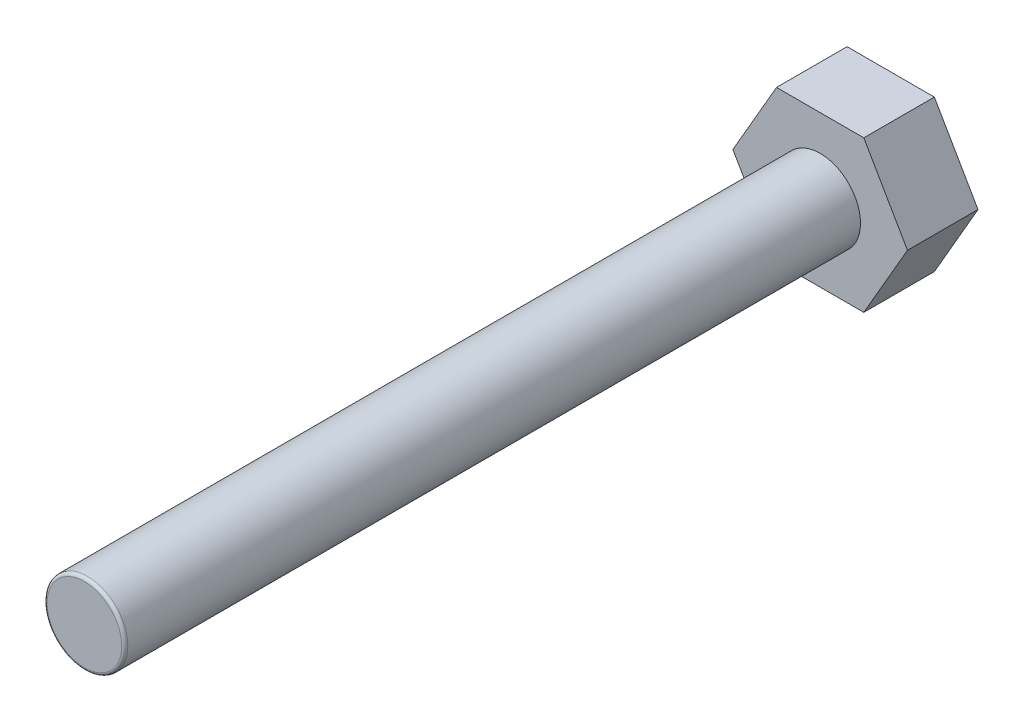
ISO-10303-21;
HEADER;
FILE_DESCRIPTION(('STEP AP214'),'2;1');
FILE_NAME('part.step','',(''),(''),'','','');
FILE_SCHEMA(('AUTOMOTIVE_DESIGN { 1 0 10303 214 1 1 1 1 }'));
ENDSEC;
DATA;
#1=APPLICATION_CONTEXT('core data for automotive mechanical design processes');
#2=APPLICATION_PROTOCOL_DEFINITION('international standard','automotive_design',2000,#1);
#3=PRODUCT_CONTEXT('',#1,'mechanical');
#4=PRODUCT('Part','Part','',(#3));
#5=PRODUCT_RELATED_PRODUCT_CATEGORY('part','',(#4));
#6=PRODUCT_DEFINITION_FORMATION('','',#4);
#7=PRODUCT_DEFINITION_CONTEXT('part definition',#1,'design');
#8=PRODUCT_DEFINITION('design','',#6,#7);
#9=PRODUCT_DEFINITION_SHAPE('','',#8);
#10=(LENGTH_UNIT() NAMED_UNIT(*) SI_UNIT(.MILLI.,.METRE.));
#11=(NAMED_UNIT(*) PLANE_ANGLE_UNIT() SI_UNIT($,.RADIAN.));
#12=(NAMED_UNIT(*) SI_UNIT($,.STERADIAN.) SOLID_ANGLE_UNIT());
#13=UNCERTAINTY_MEASURE_WITH_UNIT(LENGTH_MEASURE(1.E-05),#10,'distance_accuracy_value','');
#14=(GEOMETRIC_REPRESENTATION_CONTEXT(3) GLOBAL_UNCERTAINTY_ASSIGNED_CONTEXT((#13)) GLOBAL_UNIT_ASSIGNED_CONTEXT((#10,
#11,#12)) REPRESENTATION_CONTEXT('',''));
#15=CARTESIAN_POINT('',(0.,0.,0.));
#16=DIRECTION('',(0.,0.,1.));
#17=DIRECTION('',(1.,0.,0.));
#18=AXIS2_PLACEMENT_3D('',#15,#16,#17);
#19=CARTESIAN_POINT('',(0.,0.,80.));
#20=DIRECTION('',(0.,0.,-1.));
#21=DIRECTION('',(-1.,0.,0.));
#22=AXIS2_PLACEMENT_3D('',#19,#20,#21);
#23=CYLINDRICAL_SURFACE('',#22,4.);
#24=CARTESIAN_POINT('',(0.,0.,79.7));
#25=DIRECTION('',(0.,0.,1.));
#26=DIRECTION('',(1.,0.,0.));
#27=AXIS2_PLACEMENT_3D('',#24,#25,#26);
#28=CIRCLE('',#27,4.);
#29=CARTESIAN_POINT('',(4.,0.,79.7));
#30=VERTEX_POINT('',#29);
#31=EDGE_CURVE('E11',#30,#30,#28,.F.);
#32=ORIENTED_EDGE('',*,*,#31,.T.);
#33=EDGE_LOOP('',(#32));
#34=FACE_BOUND('',#33,.T.);
#35=CARTESIAN_POINT('',(0.,0.,7.));
#36=DIRECTION('',(0.,0.,1.));
#37=DIRECTION('',(1.,0.,0.));
#38=AXIS2_PLACEMENT_3D('',#35,#36,#37);
#39=CIRCLE('',#38,4.);
#40=CARTESIAN_POINT('',(4.,0.,7.));
#41=VERTEX_POINT('',#40);
#42=EDGE_CURVE('E124',#41,#41,#39,.T.);
#43=ORIENTED_EDGE('',*,*,#42,.T.);
#44=EDGE_LOOP('',(#43));
#45=FACE_BOUND('',#44,.T.);
#46=ADVANCED_FACE('F33',(#34,#45),#23,.T.);
#47=CARTESIAN_POINT('',(0.,0.,80.));
#48=DIRECTION('',(0.,0.,1.));
#49=DIRECTION('',(1.,0.,0.));
#50=AXIS2_PLACEMENT_3D('',#47,#48,#49);
#51=PLANE('',#50);
#52=CARTESIAN_POINT('',(0.,0.,80.));
#53=DIRECTION('',(0.,0.,1.));
#54=DIRECTION('',(1.,0.,0.));
#55=AXIS2_PLACEMENT_3D('',#52,#53,#54);
#56=CIRCLE('',#55,3.7);
#57=CARTESIAN_POINT('',(3.7,0.,80.));
#58=VERTEX_POINT('',#57);
#59=EDGE_CURVE('E42',#58,#58,#56,.T.);
#60=ORIENTED_EDGE('',*,*,#59,.T.);
#61=EDGE_LOOP('',(#60));
#62=FACE_BOUND('',#61,.T.);
#63=ADVANCED_FACE('F142',(#62),#51,.T.);
#64=CARTESIAN_POINT('',(0.,0.,7.));
#65=DIRECTION('',(0.,0.,1.));
#66=DIRECTION('',(1.,0.,0.));
#67=AXIS2_PLACEMENT_3D('',#64,#65,#66);
#68=PLANE('',#67);
#69=DIRECTION('',(0.5,-0.866025403784438,0.));
#70=VECTOR('',#69,1.);
#71=CARTESIAN_POINT('',(-8.66025403784439,0.,7.));
#72=LINE('',#71,#70);
#73=CARTESIAN_POINT('',(-8.66025403784439,0.,7.));
#74=VERTEX_POINT('',#73);
#75=CARTESIAN_POINT('',(-4.33012701892219,-7.5,7.));
#76=VERTEX_POINT('',#75);
#77=EDGE_CURVE('E131',#74,#76,#72,.T.);
#78=ORIENTED_EDGE('',*,*,#77,.T.);
#79=DIRECTION('',(1.,0.,0.));
#80=VECTOR('',#79,1.);
#81=CARTESIAN_POINT('',(-4.33012701892219,-7.5,7.));
#82=LINE('',#81,#80);
#83=CARTESIAN_POINT('',(4.33012701892219,-7.5,7.));
#84=VERTEX_POINT('',#83);
#85=EDGE_CURVE('E88',#76,#84,#82,.T.);
#86=ORIENTED_EDGE('',*,*,#85,.T.);
#87=DIRECTION('',(0.5,0.866025403784439,0.));
#88=VECTOR('',#87,1.);
#89=CARTESIAN_POINT('',(4.33012701892219,-7.5,7.));
#90=LINE('',#89,#88);
#91=CARTESIAN_POINT('',(8.66025403784439,0.,7.));
#92=VERTEX_POINT('',#91);
#93=EDGE_CURVE('E102',#84,#92,#90,.T.);
#94=ORIENTED_EDGE('',*,*,#93,.T.);
#95=DIRECTION('',(-0.5,0.866025403784438,0.));
#96=VECTOR('',#95,1.);
#97=CARTESIAN_POINT('',(8.66025403784439,0.,7.));
#98=LINE('',#97,#96);
#99=CARTESIAN_POINT('',(4.33012701892219,7.5,7.));
#100=VERTEX_POINT('',#99);
#101=EDGE_CURVE('E95',#92,#100,#98,.T.);
#102=ORIENTED_EDGE('',*,*,#101,.T.);
#103=DIRECTION('',(-1.,0.,0.));
#104=VECTOR('',#103,1.);
#105=CARTESIAN_POINT('',(4.33012701892219,7.5,7.));
#106=LINE('',#105,#104);
#107=CARTESIAN_POINT('',(-4.3301270189222,7.5,7.));
#108=VERTEX_POINT('',#107);
#109=EDGE_CURVE('E100',#100,#108,#106,.T.);
#110=ORIENTED_EDGE('',*,*,#109,.T.);
#111=DIRECTION('',(-0.5,-0.866025403784439,0.));
#112=VECTOR('',#111,1.);
#113=CARTESIAN_POINT('',(-4.3301270189222,7.5,7.));
#114=LINE('',#113,#112);
#115=EDGE_CURVE('E50',#108,#74,#114,.T.);
#116=ORIENTED_EDGE('',*,*,#115,.T.);
#117=EDGE_LOOP('',(#78,#86,#94,#102,#110,#116));
#118=FACE_BOUND('',#117,.T.);
#119=ORIENTED_EDGE('',*,*,#42,.F.);
#120=EDGE_LOOP('',(#119));
#121=FACE_BOUND('',#120,.T.);
#122=ADVANCED_FACE('F97',(#118,#121),#68,.T.);
#123=CARTESIAN_POINT('',(-8.66025403784439,0.,7.));
#124=DIRECTION('',(0.866025403784438,0.5,0.));
#125=DIRECTION('',(-0.5,0.866025403784438,0.));
#126=AXIS2_PLACEMENT_3D('',#123,#124,#125);
#127=PLANE('',#126);
#128=DIRECTION('',(0.5,-0.866025403784438,0.));
#129=VECTOR('',#128,1.);
#130=CARTESIAN_POINT('',(-8.66025403784439,0.,0.));
#131=LINE('',#130,#129);
#132=CARTESIAN_POINT('',(-8.66025403784439,0.,0.));
#133=VERTEX_POINT('',#132);
#134=CARTESIAN_POINT('',(-4.33012701892219,-7.5,0.));
#135=VERTEX_POINT('',#134);
#136=EDGE_CURVE('E120',#133,#135,#131,.T.);
#137=ORIENTED_EDGE('',*,*,#136,.T.);
#138=DIRECTION('',(0.,0.,-1.));
#139=VECTOR('',#138,1.);
#140=CARTESIAN_POINT('',(-4.33012701892219,-7.5,7.));
#141=LINE('',#140,#139);
#142=EDGE_CURVE('E138',#76,#135,#141,.T.);
#143=ORIENTED_EDGE('',*,*,#142,.F.);
#144=ORIENTED_EDGE('',*,*,#77,.F.);
#145=DIRECTION('',(0.,0.,-1.));
#146=VECTOR('',#145,1.);
#147=CARTESIAN_POINT('',(-8.66025403784439,0.,7.));
#148=LINE('',#147,#146);
#149=EDGE_CURVE('E116',#74,#133,#148,.T.);
#150=ORIENTED_EDGE('',*,*,#149,.T.);
#151=EDGE_LOOP('',(#137,#143,#144,#150));
#152=FACE_BOUND('',#151,.T.);
#153=ADVANCED_FACE('F162',(#152),#127,.F.);
#154=CARTESIAN_POINT('',(-4.33012701892219,-7.5,7.));
#155=DIRECTION('',(0.,1.,0.));
#156=DIRECTION('',(0.,0.,1.));
#157=AXIS2_PLACEMENT_3D('',#154,#155,#156);
#158=PLANE('',#157);
#159=DIRECTION('',(1.,0.,0.));
#160=VECTOR('',#159,1.);
#161=CARTESIAN_POINT('',(-4.33012701892219,-7.5,0.));
#162=LINE('',#161,#160);
#163=CARTESIAN_POINT('',(4.33012701892219,-7.5,0.));
#164=VERTEX_POINT('',#163);
#165=EDGE_CURVE('E123',#135,#164,#162,.T.);
#166=ORIENTED_EDGE('',*,*,#165,.T.);
#167=DIRECTION('',(0.,0.,-1.));
#168=VECTOR('',#167,1.);
#169=CARTESIAN_POINT('',(4.33012701892219,-7.5,7.));
#170=LINE('',#169,#168);
#171=EDGE_CURVE('E135',#84,#164,#170,.T.);
#172=ORIENTED_EDGE('',*,*,#171,.F.);
#173=ORIENTED_EDGE('',*,*,#85,.F.);
#174=ORIENTED_EDGE('',*,*,#142,.T.);
#175=EDGE_LOOP('',(#166,#172,#173,#174));
#176=FACE_BOUND('',#175,.T.);
#177=ADVANCED_FACE('F165',(#176),#158,.F.);
#178=CARTESIAN_POINT('',(4.33012701892219,-7.5,7.));
#179=DIRECTION('',(-0.866025403784439,0.5,0.));
#180=DIRECTION('',(-0.5,-0.866025403784439,0.));
#181=AXIS2_PLACEMENT_3D('',#178,#179,#180);
#182=PLANE('',#181);
#183=DIRECTION('',(0.5,0.866025403784439,0.));
#184=VECTOR('',#183,1.);
#185=CARTESIAN_POINT('',(4.33012701892219,-7.5,0.));
#186=LINE('',#185,#184);
#187=CARTESIAN_POINT('',(8.66025403784439,0.,0.));
#188=VERTEX_POINT('',#187);
#189=EDGE_CURVE('E126',#164,#188,#186,.T.);
#190=ORIENTED_EDGE('',*,*,#189,.T.);
#191=DIRECTION('',(0.,0.,-1.));
#192=VECTOR('',#191,1.);
#193=CARTESIAN_POINT('',(8.66025403784439,0.,7.));
#194=LINE('',#193,#192);
#195=EDGE_CURVE('E111',#92,#188,#194,.T.);
#196=ORIENTED_EDGE('',*,*,#195,.F.);
#197=ORIENTED_EDGE('',*,*,#93,.F.);
#198=ORIENTED_EDGE('',*,*,#171,.T.);
#199=EDGE_LOOP('',(#190,#196,#197,#198));
#200=FACE_BOUND('',#199,.T.);
#201=ADVANCED_FACE('F169',(#200),#182,.F.);
#202=CARTESIAN_POINT('',(8.66025403784439,0.,7.));
#203=DIRECTION('',(-0.866025403784438,-0.5,0.));
#204=DIRECTION('',(0.5,-0.866025403784439,0.));
#205=AXIS2_PLACEMENT_3D('',#202,#203,#204);
#206=PLANE('',#205);
#207=DIRECTION('',(-0.5,0.866025403784438,0.));
#208=VECTOR('',#207,1.);
#209=CARTESIAN_POINT('',(8.66025403784439,0.,0.));
#210=LINE('',#209,#208);
#211=CARTESIAN_POINT('',(4.33012701892219,7.5,0.));
#212=VERTEX_POINT('',#211);
#213=EDGE_CURVE('E110',#188,#212,#210,.T.);
#214=ORIENTED_EDGE('',*,*,#213,.T.);
#215=DIRECTION('',(0.,0.,-1.));
#216=VECTOR('',#215,1.);
#217=CARTESIAN_POINT('',(4.33012701892219,7.5,7.));
#218=LINE('',#217,#216);
#219=EDGE_CURVE('E107',#100,#212,#218,.T.);
#220=ORIENTED_EDGE('',*,*,#219,.F.);
#221=ORIENTED_EDGE('',*,*,#101,.F.);
#222=ORIENTED_EDGE('',*,*,#195,.T.);
#223=EDGE_LOOP('',(#214,#220,#221,#222));
#224=FACE_BOUND('',#223,.T.);
#225=ADVANCED_FACE('F108',(#224),#206,.F.);
#226=CARTESIAN_POINT('',(4.33012701892219,7.5,7.));
#227=DIRECTION('',(0.,-1.,0.));
#228=DIRECTION('',(1.,0.,0.));
#229=AXIS2_PLACEMENT_3D('',#226,#227,#228);
#230=PLANE('',#229);
#231=DIRECTION('',(-1.,0.,0.));
#232=VECTOR('',#231,1.);
#233=CARTESIAN_POINT('',(4.33012701892219,7.5,0.));
#234=LINE('',#233,#232);
#235=CARTESIAN_POINT('',(-4.3301270189222,7.5,0.));
#236=VERTEX_POINT('',#235);
#237=EDGE_CURVE('E73',#212,#236,#234,.T.);
#238=ORIENTED_EDGE('',*,*,#237,.T.);
#239=DIRECTION('',(0.,0.,-1.));
#240=VECTOR('',#239,1.);
#241=CARTESIAN_POINT('',(-4.3301270189222,7.5,7.));
#242=LINE('',#241,#240);
#243=EDGE_CURVE('E112',#108,#236,#242,.T.);
#244=ORIENTED_EDGE('',*,*,#243,.F.);
#245=ORIENTED_EDGE('',*,*,#109,.F.);
#246=ORIENTED_EDGE('',*,*,#219,.T.);
#247=EDGE_LOOP('',(#238,#244,#245,#246));
#248=FACE_BOUND('',#247,.T.);
#249=ADVANCED_FACE('F114',(#248),#230,.F.);
#250=CARTESIAN_POINT('',(-4.3301270189222,7.5,7.));
#251=DIRECTION('',(0.866025403784439,-0.5,0.));
#252=DIRECTION('',(0.5,0.866025403784439,0.));
#253=AXIS2_PLACEMENT_3D('',#250,#251,#252);
#254=PLANE('',#253);
#255=DIRECTION('',(-0.5,-0.866025403784439,0.));
#256=VECTOR('',#255,1.);
#257=CARTESIAN_POINT('',(-4.3301270189222,7.5,0.));
#258=LINE('',#257,#256);
#259=EDGE_CURVE('E79',#236,#133,#258,.T.);
#260=ORIENTED_EDGE('',*,*,#259,.T.);
#261=ORIENTED_EDGE('',*,*,#149,.F.);
#262=ORIENTED_EDGE('',*,*,#115,.F.);
#263=ORIENTED_EDGE('',*,*,#243,.T.);
#264=EDGE_LOOP('',(#260,#261,#262,#263));
#265=FACE_BOUND('',#264,.T.);
#266=ADVANCED_FACE('F150',(#265),#254,.F.);
#267=CARTESIAN_POINT('',(0.,0.,0.));
#268=DIRECTION('',(0.,0.,1.));
#269=DIRECTION('',(1.,0.,0.));
#270=AXIS2_PLACEMENT_3D('',#267,#268,#269);
#271=PLANE('',#270);
#272=ORIENTED_EDGE('',*,*,#136,.F.);
#273=ORIENTED_EDGE('',*,*,#259,.F.);
#274=ORIENTED_EDGE('',*,*,#237,.F.);
#275=ORIENTED_EDGE('',*,*,#213,.F.);
#276=ORIENTED_EDGE('',*,*,#189,.F.);
#277=ORIENTED_EDGE('',*,*,#165,.F.);
#278=EDGE_LOOP('',(#272,#273,#274,#275,#276,#277));
#279=FACE_BOUND('',#278,.T.);
#280=ADVANCED_FACE('F145',(#279),#271,.F.);
#281=CARTESIAN_POINT('',(0.,0.,79.7));
#282=DIRECTION('',(0.,0.,1.));
#283=DIRECTION('',(1.,0.,0.));
#284=AXIS2_PLACEMENT_3D('',#281,#282,#283);
#285=TOROIDAL_SURFACE('',#284,3.7,0.3);
#286=ORIENTED_EDGE('',*,*,#31,.F.);
#287=EDGE_LOOP('',(#286));
#288=FACE_BOUND('',#287,.T.);
#289=ORIENTED_EDGE('',*,*,#59,.F.);
#290=EDGE_LOOP('',(#289));
#291=FACE_BOUND('',#290,.T.);
#292=ADVANCED_FACE('F35',(#288,#291),#285,.T.);
#293=CLOSED_SHELL('',(#46,#63,#122,#153,#177,#201,#225,#249,#266,#280,#292));
#294=MANIFOLD_SOLID_BREP('B2',#293);
#295=ADVANCED_BREP_SHAPE_REPRESENTATION('',(#18,#294),#14);
#296=SHAPE_DEFINITION_REPRESENTATION(#9,#295);
ENDSEC;
END-ISO-10303-21;
